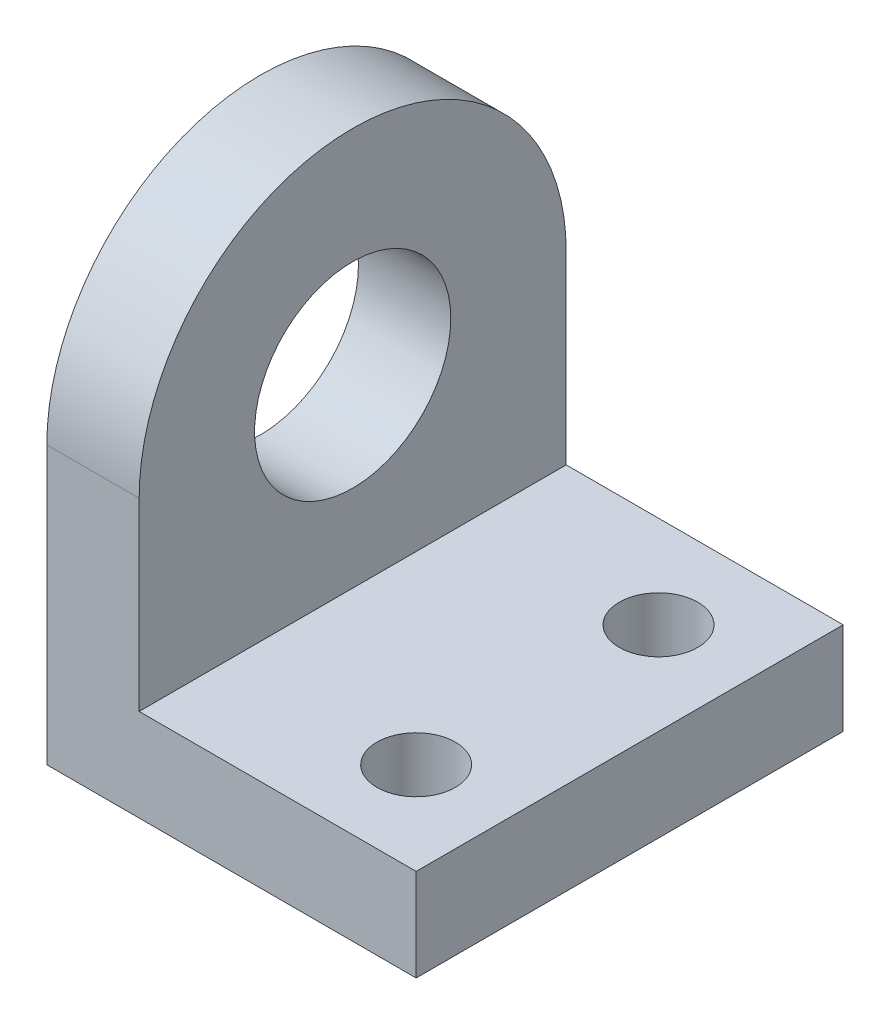
ISO-10303-21;
HEADER;
FILE_DESCRIPTION(('STEP AP214'),'2;1');
FILE_NAME('part.step','',(''),(''),'','','');
FILE_SCHEMA(('AUTOMOTIVE_DESIGN { 1 0 10303 214 1 1 1 1 }'));
ENDSEC;
DATA;
#1=APPLICATION_CONTEXT('core data for automotive mechanical design processes');
#2=APPLICATION_PROTOCOL_DEFINITION('international standard','automotive_design',2000,#1);
#3=PRODUCT_CONTEXT('',#1,'mechanical');
#4=PRODUCT('Part','Part','',(#3));
#5=PRODUCT_RELATED_PRODUCT_CATEGORY('part','',(#4));
#6=PRODUCT_DEFINITION_FORMATION('','',#4);
#7=PRODUCT_DEFINITION_CONTEXT('part definition',#1,'design');
#8=PRODUCT_DEFINITION('design','',#6,#7);
#9=PRODUCT_DEFINITION_SHAPE('','',#8);
#10=(LENGTH_UNIT() NAMED_UNIT(*) SI_UNIT(.MILLI.,.METRE.));
#11=(NAMED_UNIT(*) PLANE_ANGLE_UNIT() SI_UNIT($,.RADIAN.));
#12=(NAMED_UNIT(*) SI_UNIT($,.STERADIAN.) SOLID_ANGLE_UNIT());
#13=UNCERTAINTY_MEASURE_WITH_UNIT(LENGTH_MEASURE(1.E-05),#10,'distance_accuracy_value','');
#14=(GEOMETRIC_REPRESENTATION_CONTEXT(3) GLOBAL_UNCERTAINTY_ASSIGNED_CONTEXT((#13)) GLOBAL_UNIT_ASSIGNED_CONTEXT((#10,
#11,#12)) REPRESENTATION_CONTEXT('',''));
#15=CARTESIAN_POINT('',(0.,0.,0.));
#16=DIRECTION('',(0.,0.,1.));
#17=DIRECTION('',(1.,0.,0.));
#18=AXIS2_PLACEMENT_3D('',#15,#16,#17);
#19=CARTESIAN_POINT('',(4.,0.,0.));
#20=DIRECTION('',(-1.,0.,0.));
#21=DIRECTION('',(0.,0.,1.));
#22=AXIS2_PLACEMENT_3D('',#19,#20,#21);
#23=PLANE('',#22);
#24=CARTESIAN_POINT('',(4.,0.,0.));
#25=DIRECTION('',(1.,0.,0.));
#26=DIRECTION('',(0.,0.,-1.));
#27=AXIS2_PLACEMENT_3D('',#24,#25,#26);
#28=CIRCLE('',#27,4.25);
#29=CARTESIAN_POINT('',(4.,0.,-4.25));
#30=VERTEX_POINT('',#29);
#31=EDGE_CURVE('E110',#30,#30,#28,.T.);
#32=ORIENTED_EDGE('',*,*,#31,.F.);
#33=EDGE_LOOP('',(#32));
#34=FACE_BOUND('',#33,.T.);
#35=DIRECTION('',(0.,0.,1.));
#36=VECTOR('',#35,1.);
#37=CARTESIAN_POINT('',(4.,-8.,9.25));
#38=LINE('',#37,#36);
#39=CARTESIAN_POINT('',(4.,-8.00000000000008,-9.25000000000008));
#40=VERTEX_POINT('',#39);
#41=CARTESIAN_POINT('',(4.,-8.,9.25));
#42=VERTEX_POINT('',#41);
#43=EDGE_CURVE('E63',#40,#42,#38,.T.);
#44=ORIENTED_EDGE('',*,*,#43,.F.);
#45=DIRECTION('',(0.,1.,0.));
#46=VECTOR('',#45,1.);
#47=CARTESIAN_POINT('',(4.,0.,-9.25000000000002));
#48=LINE('',#47,#46);
#49=CARTESIAN_POINT('',(4.,0.,-9.25000000000002));
#50=VERTEX_POINT('',#49);
#51=EDGE_CURVE('E68',#40,#50,#48,.T.);
#52=ORIENTED_EDGE('',*,*,#51,.T.);
#53=CARTESIAN_POINT('',(4.,0.,0.));
#54=DIRECTION('',(1.,0.,0.));
#55=DIRECTION('',(0.,0.,1.));
#56=AXIS2_PLACEMENT_3D('',#53,#54,#55);
#57=CIRCLE('',#56,9.25);
#58=CARTESIAN_POINT('',(4.,0.,9.25));
#59=VERTEX_POINT('',#58);
#60=EDGE_CURVE('E99',#50,#59,#57,.T.);
#61=ORIENTED_EDGE('',*,*,#60,.T.);
#62=DIRECTION('',(0.,-1.,0.));
#63=VECTOR('',#62,1.);
#64=CARTESIAN_POINT('',(4.,0.,9.25));
#65=LINE('',#64,#63);
#66=EDGE_CURVE('E124',#59,#42,#65,.T.);
#67=ORIENTED_EDGE('',*,*,#66,.T.);
#68=EDGE_LOOP('',(#44,#52,#61,#67));
#69=FACE_BOUND('',#68,.T.);
#70=ADVANCED_FACE('F46',(#34,#69),#23,.F.);
#71=CARTESIAN_POINT('',(0.,0.,0.));
#72=DIRECTION('',(-1.,0.,0.));
#73=DIRECTION('',(0.,0.,1.));
#74=AXIS2_PLACEMENT_3D('',#71,#72,#73);
#75=PLANE('',#74);
#76=CARTESIAN_POINT('',(0.,0.,0.));
#77=DIRECTION('',(1.,0.,0.));
#78=DIRECTION('',(0.,0.,1.));
#79=AXIS2_PLACEMENT_3D('',#76,#77,#78);
#80=CIRCLE('',#79,9.25);
#81=CARTESIAN_POINT('',(0.,0.,-9.25000000000002));
#82=VERTEX_POINT('',#81);
#83=CARTESIAN_POINT('',(0.,0.,9.25));
#84=VERTEX_POINT('',#83);
#85=EDGE_CURVE('E105',#82,#84,#80,.T.);
#86=ORIENTED_EDGE('',*,*,#85,.F.);
#87=DIRECTION('',(0.,1.,0.));
#88=VECTOR('',#87,1.);
#89=CARTESIAN_POINT('',(0.,0.,-9.25000000000002));
#90=LINE('',#89,#88);
#91=CARTESIAN_POINT('',(0.,-12.0000000000001,-9.25000000000008));
#92=VERTEX_POINT('',#91);
#93=EDGE_CURVE('E88',#92,#82,#90,.T.);
#94=ORIENTED_EDGE('',*,*,#93,.F.);
#95=DIRECTION('',(0.,0.,-1.));
#96=VECTOR('',#95,1.);
#97=CARTESIAN_POINT('',(0.,-12.,9.24999999999993));
#98=LINE('',#97,#96);
#99=CARTESIAN_POINT('',(0.,-12.,9.24999999999993));
#100=VERTEX_POINT('',#99);
#101=EDGE_CURVE('E100',#100,#92,#98,.T.);
#102=ORIENTED_EDGE('',*,*,#101,.F.);
#103=DIRECTION('',(0.,-1.,0.));
#104=VECTOR('',#103,1.);
#105=CARTESIAN_POINT('',(0.,0.,9.25));
#106=LINE('',#105,#104);
#107=EDGE_CURVE('E109',#84,#100,#106,.T.);
#108=ORIENTED_EDGE('',*,*,#107,.F.);
#109=EDGE_LOOP('',(#86,#94,#102,#108));
#110=FACE_BOUND('',#109,.T.);
#111=CARTESIAN_POINT('',(0.,0.,0.));
#112=DIRECTION('',(1.,0.,0.));
#113=DIRECTION('',(0.,0.,-1.));
#114=AXIS2_PLACEMENT_3D('',#111,#112,#113);
#115=CIRCLE('',#114,4.25);
#116=CARTESIAN_POINT('',(0.,0.,-4.25));
#117=VERTEX_POINT('',#116);
#118=EDGE_CURVE('E114',#117,#117,#115,.T.);
#119=ORIENTED_EDGE('',*,*,#118,.T.);
#120=EDGE_LOOP('',(#119));
#121=FACE_BOUND('',#120,.T.);
#122=ADVANCED_FACE('F107',(#110,#121),#75,.T.);
#123=CARTESIAN_POINT('',(4.,0.,0.));
#124=DIRECTION('',(-1.,0.,0.));
#125=DIRECTION('',(0.,0.,1.));
#126=AXIS2_PLACEMENT_3D('',#123,#124,#125);
#127=CYLINDRICAL_SURFACE('',#126,9.25);
#128=ORIENTED_EDGE('',*,*,#85,.T.);
#129=DIRECTION('',(-1.,0.,0.));
#130=VECTOR('',#129,1.);
#131=CARTESIAN_POINT('',(4.,0.,9.25));
#132=LINE('',#131,#130);
#133=EDGE_CURVE('E13',#59,#84,#132,.T.);
#134=ORIENTED_EDGE('',*,*,#133,.F.);
#135=ORIENTED_EDGE('',*,*,#60,.F.);
#136=DIRECTION('',(-1.,0.,0.));
#137=VECTOR('',#136,1.);
#138=CARTESIAN_POINT('',(4.,0.,-9.25000000000002));
#139=LINE('',#138,#137);
#140=EDGE_CURVE('E91',#50,#82,#139,.T.);
#141=ORIENTED_EDGE('',*,*,#140,.T.);
#142=EDGE_LOOP('',(#128,#134,#135,#141));
#143=FACE_BOUND('',#142,.T.);
#144=ADVANCED_FACE('F48',(#143),#127,.T.);
#145=CARTESIAN_POINT('',(4.,0.,9.25));
#146=DIRECTION('',(0.,0.,-1.));
#147=DIRECTION('',(0.,1.,0.));
#148=AXIS2_PLACEMENT_3D('',#145,#146,#147);
#149=PLANE('',#148);
#150=ORIENTED_EDGE('',*,*,#107,.T.);
#151=DIRECTION('',(-1.,0.,0.));
#152=VECTOR('',#151,1.);
#153=CARTESIAN_POINT('',(4.,-12.,9.24999999999993));
#154=LINE('',#153,#152);
#155=CARTESIAN_POINT('',(16.,-12.,9.24999999999993));
#156=VERTEX_POINT('',#155);
#157=EDGE_CURVE('E55',#156,#100,#154,.T.);
#158=ORIENTED_EDGE('',*,*,#157,.F.);
#159=DIRECTION('',(0.,-1.,0.));
#160=VECTOR('',#159,1.);
#161=CARTESIAN_POINT('',(16.,-12.,9.24999999999993));
#162=LINE('',#161,#160);
#163=CARTESIAN_POINT('',(16.,-7.99999999999996,9.25));
#164=VERTEX_POINT('',#163);
#165=EDGE_CURVE('E138',#164,#156,#162,.T.);
#166=ORIENTED_EDGE('',*,*,#165,.F.);
#167=DIRECTION('',(-1.,0.,0.));
#168=VECTOR('',#167,1.);
#169=CARTESIAN_POINT('',(16.,-7.99999999999996,9.25));
#170=LINE('',#169,#168);
#171=EDGE_CURVE('E140',#164,#42,#170,.T.);
#172=ORIENTED_EDGE('',*,*,#171,.T.);
#173=ORIENTED_EDGE('',*,*,#66,.F.);
#174=ORIENTED_EDGE('',*,*,#133,.T.);
#175=EDGE_LOOP('',(#150,#158,#166,#172,#173,#174));
#176=FACE_BOUND('',#175,.T.);
#177=ADVANCED_FACE('F167',(#176),#149,.F.);
#178=CARTESIAN_POINT('',(4.,-12.,9.24999999999993));
#179=DIRECTION('',(0.,1.,0.));
#180=DIRECTION('',(0.,0.,1.));
#181=AXIS2_PLACEMENT_3D('',#178,#179,#180);
#182=PLANE('',#181);
#183=CARTESIAN_POINT('',(12.,-12.0000000000001,-5.25000000000009));
#184=DIRECTION('',(0.,1.,0.));
#185=DIRECTION('',(0.,0.,1.));
#186=AXIS2_PLACEMENT_3D('',#183,#184,#185);
#187=CIRCLE('',#186,1.7);
#188=CARTESIAN_POINT('',(12.,-12.0000000000001,-3.55000000000009));
#189=VERTEX_POINT('',#188);
#190=EDGE_CURVE('E181',#189,#189,#187,.T.);
#191=ORIENTED_EDGE('',*,*,#190,.T.);
#192=EDGE_LOOP('',(#191));
#193=FACE_BOUND('',#192,.T.);
#194=CARTESIAN_POINT('',(12.,-12.,5.24999999999992));
#195=DIRECTION('',(0.,1.,0.));
#196=DIRECTION('',(0.,0.,1.));
#197=AXIS2_PLACEMENT_3D('',#194,#195,#196);
#198=CIRCLE('',#197,1.7);
#199=CARTESIAN_POINT('',(12.,-12.,6.94999999999992));
#200=VERTEX_POINT('',#199);
#201=EDGE_CURVE('E139',#200,#200,#198,.T.);
#202=ORIENTED_EDGE('',*,*,#201,.T.);
#203=EDGE_LOOP('',(#202));
#204=FACE_BOUND('',#203,.T.);
#205=ORIENTED_EDGE('',*,*,#101,.T.);
#206=DIRECTION('',(-1.,0.,0.));
#207=VECTOR('',#206,1.);
#208=CARTESIAN_POINT('',(4.,-12.0000000000001,-9.25000000000008));
#209=LINE('',#208,#207);
#210=CARTESIAN_POINT('',(16.,-12.0000000000001,-9.25000000000008));
#211=VERTEX_POINT('',#210);
#212=EDGE_CURVE('E95',#211,#92,#209,.T.);
#213=ORIENTED_EDGE('',*,*,#212,.F.);
#214=DIRECTION('',(0.,0.,-1.));
#215=VECTOR('',#214,1.);
#216=CARTESIAN_POINT('',(16.,-12.,9.24999999999993));
#217=LINE('',#216,#215);
#218=EDGE_CURVE('E170',#156,#211,#217,.T.);
#219=ORIENTED_EDGE('',*,*,#218,.F.);
#220=ORIENTED_EDGE('',*,*,#157,.T.);
#221=EDGE_LOOP('',(#205,#213,#219,#220));
#222=FACE_BOUND('',#221,.T.);
#223=ADVANCED_FACE('F171',(#193,#204,#222),#182,.F.);
#224=CARTESIAN_POINT('',(4.,0.,-9.25000000000002));
#225=DIRECTION('',(0.,0.,1.));
#226=DIRECTION('',(0.,-1.,0.));
#227=AXIS2_PLACEMENT_3D('',#224,#225,#226);
#228=PLANE('',#227);
#229=ORIENTED_EDGE('',*,*,#93,.T.);
#230=ORIENTED_EDGE('',*,*,#140,.F.);
#231=ORIENTED_EDGE('',*,*,#51,.F.);
#232=DIRECTION('',(-1.,0.,0.));
#233=VECTOR('',#232,1.);
#234=CARTESIAN_POINT('',(16.,-8.00000000000008,-9.25000000000008));
#235=LINE('',#234,#233);
#236=CARTESIAN_POINT('',(16.,-8.00000000000008,-9.25000000000008));
#237=VERTEX_POINT('',#236);
#238=EDGE_CURVE('E131',#237,#40,#235,.T.);
#239=ORIENTED_EDGE('',*,*,#238,.F.);
#240=DIRECTION('',(0.,1.,0.));
#241=VECTOR('',#240,1.);
#242=CARTESIAN_POINT('',(16.,-12.0000000000001,-9.25000000000008));
#243=LINE('',#242,#241);
#244=EDGE_CURVE('E155',#211,#237,#243,.T.);
#245=ORIENTED_EDGE('',*,*,#244,.F.);
#246=ORIENTED_EDGE('',*,*,#212,.T.);
#247=EDGE_LOOP('',(#229,#230,#231,#239,#245,#246));
#248=FACE_BOUND('',#247,.T.);
#249=ADVANCED_FACE('F90',(#248),#228,.F.);
#250=CARTESIAN_POINT('',(4.,0.,0.));
#251=DIRECTION('',(-1.,0.,0.));
#252=DIRECTION('',(0.,0.,1.));
#253=AXIS2_PLACEMENT_3D('',#250,#251,#252);
#254=CYLINDRICAL_SURFACE('',#253,4.25);
#255=ORIENTED_EDGE('',*,*,#31,.T.);
#256=EDGE_LOOP('',(#255));
#257=FACE_BOUND('',#256,.T.);
#258=ORIENTED_EDGE('',*,*,#118,.F.);
#259=EDGE_LOOP('',(#258));
#260=FACE_BOUND('',#259,.T.);
#261=ADVANCED_FACE('F192',(#257,#260),#254,.F.);
#262=CARTESIAN_POINT('',(16.,-7.99999999999996,9.25));
#263=DIRECTION('',(0.,-1.,0.));
#264=DIRECTION('',(0.,0.,-1.));
#265=AXIS2_PLACEMENT_3D('',#262,#263,#264);
#266=PLANE('',#265);
#267=CARTESIAN_POINT('',(12.,-8.00000000000007,-5.25000000000009));
#268=DIRECTION('',(0.,1.,0.));
#269=DIRECTION('',(0.,0.,1.));
#270=AXIS2_PLACEMENT_3D('',#267,#268,#269);
#271=CIRCLE('',#270,1.7);
#272=CARTESIAN_POINT('',(12.,-8.00000000000006,-3.55000000000009));
#273=VERTEX_POINT('',#272);
#274=EDGE_CURVE('E184',#273,#273,#271,.T.);
#275=ORIENTED_EDGE('',*,*,#274,.F.);
#276=EDGE_LOOP('',(#275));
#277=FACE_BOUND('',#276,.T.);
#278=CARTESIAN_POINT('',(12.,-7.99999999999999,5.25));
#279=DIRECTION('',(0.,1.,0.));
#280=DIRECTION('',(0.,0.,1.));
#281=AXIS2_PLACEMENT_3D('',#278,#279,#280);
#282=CIRCLE('',#281,1.7);
#283=CARTESIAN_POINT('',(12.,-7.99999999999998,6.95));
#284=VERTEX_POINT('',#283);
#285=EDGE_CURVE('E178',#284,#284,#282,.T.);
#286=ORIENTED_EDGE('',*,*,#285,.F.);
#287=EDGE_LOOP('',(#286));
#288=FACE_BOUND('',#287,.T.);
#289=ORIENTED_EDGE('',*,*,#43,.T.);
#290=ORIENTED_EDGE('',*,*,#171,.F.);
#291=DIRECTION('',(0.,0.,1.));
#292=VECTOR('',#291,1.);
#293=CARTESIAN_POINT('',(16.,-7.99999999999996,9.25));
#294=LINE('',#293,#292);
#295=EDGE_CURVE('E135',#237,#164,#294,.T.);
#296=ORIENTED_EDGE('',*,*,#295,.F.);
#297=ORIENTED_EDGE('',*,*,#238,.T.);
#298=EDGE_LOOP('',(#289,#290,#296,#297));
#299=FACE_BOUND('',#298,.T.);
#300=ADVANCED_FACE('F148',(#277,#288,#299),#266,.F.);
#301=CARTESIAN_POINT('',(16.,0.,0.));
#302=DIRECTION('',(-1.,0.,0.));
#303=DIRECTION('',(0.,0.,1.));
#304=AXIS2_PLACEMENT_3D('',#301,#302,#303);
#305=PLANE('',#304);
#306=ORIENTED_EDGE('',*,*,#165,.T.);
#307=ORIENTED_EDGE('',*,*,#218,.T.);
#308=ORIENTED_EDGE('',*,*,#244,.T.);
#309=ORIENTED_EDGE('',*,*,#295,.T.);
#310=EDGE_LOOP('',(#306,#307,#308,#309));
#311=FACE_BOUND('',#310,.T.);
#312=ADVANCED_FACE('F173',(#311),#305,.F.);
#313=CARTESIAN_POINT('',(12.,-7.99999999999999,5.25));
#314=DIRECTION('',(0.,1.,0.));
#315=DIRECTION('',(0.,0.,1.));
#316=AXIS2_PLACEMENT_3D('',#313,#314,#315);
#317=CYLINDRICAL_SURFACE('',#316,1.7);
#318=ORIENTED_EDGE('',*,*,#201,.F.);
#319=EDGE_LOOP('',(#318));
#320=FACE_BOUND('',#319,.T.);
#321=ORIENTED_EDGE('',*,*,#285,.T.);
#322=EDGE_LOOP('',(#321));
#323=FACE_BOUND('',#322,.T.);
#324=ADVANCED_FACE('F196',(#320,#323),#317,.F.);
#325=CARTESIAN_POINT('',(12.,-8.00000000000007,-5.25000000000009));
#326=DIRECTION('',(0.,1.,0.));
#327=DIRECTION('',(0.,0.,1.));
#328=AXIS2_PLACEMENT_3D('',#325,#326,#327);
#329=CYLINDRICAL_SURFACE('',#328,1.7);
#330=ORIENTED_EDGE('',*,*,#190,.F.);
#331=EDGE_LOOP('',(#330));
#332=FACE_BOUND('',#331,.T.);
#333=ORIENTED_EDGE('',*,*,#274,.T.);
#334=EDGE_LOOP('',(#333));
#335=FACE_BOUND('',#334,.T.);
#336=ADVANCED_FACE('F188',(#332,#335),#329,.F.);
#337=CLOSED_SHELL('',(#70,#122,#144,#177,#223,#249,#261,#300,#312,#324,#336));
#338=MANIFOLD_SOLID_BREP('B2',#337);
#339=ADVANCED_BREP_SHAPE_REPRESENTATION('',(#18,#338),#14);
#340=SHAPE_DEFINITION_REPRESENTATION(#9,#339);
ENDSEC;
END-ISO-10303-21;
